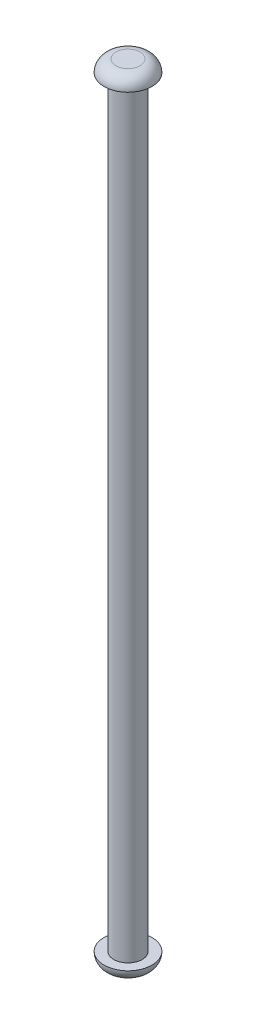
ISO-10303-21;
HEADER;
FILE_DESCRIPTION(('STEP AP214'),'2;1');
FILE_NAME('part.step','',(''),(''),'','','');
FILE_SCHEMA(('AUTOMOTIVE_DESIGN { 1 0 10303 214 1 1 1 1 }'));
ENDSEC;
DATA;
#1=APPLICATION_CONTEXT('core data for automotive mechanical design processes');
#2=APPLICATION_PROTOCOL_DEFINITION('international standard','automotive_design',2000,#1);
#3=PRODUCT_CONTEXT('',#1,'mechanical');
#4=PRODUCT('Part','Part','',(#3));
#5=PRODUCT_RELATED_PRODUCT_CATEGORY('part','',(#4));
#6=PRODUCT_DEFINITION_FORMATION('','',#4);
#7=PRODUCT_DEFINITION_CONTEXT('part definition',#1,'design');
#8=PRODUCT_DEFINITION('design','',#6,#7);
#9=PRODUCT_DEFINITION_SHAPE('','',#8);
#10=(LENGTH_UNIT() NAMED_UNIT(*) SI_UNIT(.MILLI.,.METRE.));
#11=(NAMED_UNIT(*) PLANE_ANGLE_UNIT() SI_UNIT($,.RADIAN.));
#12=(NAMED_UNIT(*) SI_UNIT($,.STERADIAN.) SOLID_ANGLE_UNIT());
#13=UNCERTAINTY_MEASURE_WITH_UNIT(LENGTH_MEASURE(1.E-05),#10,'distance_accuracy_value','');
#14=(GEOMETRIC_REPRESENTATION_CONTEXT(3) GLOBAL_UNCERTAINTY_ASSIGNED_CONTEXT((#13)) GLOBAL_UNIT_ASSIGNED_CONTEXT((#10,
#11,#12)) REPRESENTATION_CONTEXT('',''));
#15=CARTESIAN_POINT('',(0.,0.,0.));
#16=DIRECTION('',(0.,0.,1.));
#17=DIRECTION('',(1.,0.,0.));
#18=AXIS2_PLACEMENT_3D('',#15,#16,#17);
#19=CARTESIAN_POINT('',(2.206625,88.9,0.));
#20=DIRECTION('',(0.,-1.,0.));
#21=DIRECTION('',(0.,0.,-1.));
#22=AXIS2_PLACEMENT_3D('',#19,#20,#21);
#23=CYLINDRICAL_SURFACE('',#22,1.190625);
#24=CARTESIAN_POINT('',(2.206625,0.,0.));
#25=DIRECTION('',(0.,1.,0.));
#26=DIRECTION('',(0.,0.,1.));
#27=AXIS2_PLACEMENT_3D('',#24,#25,#26);
#28=CIRCLE('',#27,1.190625);
#29=CARTESIAN_POINT('',(2.206625,0.,1.190625));
#30=VERTEX_POINT('',#29);
#31=EDGE_CURVE('E63',#30,#30,#28,.T.);
#32=ORIENTED_EDGE('',*,*,#31,.T.);
#33=EDGE_LOOP('',(#32));
#34=FACE_BOUND('',#33,.T.);
#35=CARTESIAN_POINT('',(2.206625,63.5,0.));
#36=DIRECTION('',(0.,1.,0.));
#37=DIRECTION('',(0.,0.,1.));
#38=AXIS2_PLACEMENT_3D('',#35,#36,#37);
#39=CIRCLE('',#38,1.190625);
#40=CARTESIAN_POINT('',(2.206625,63.5,1.190625));
#41=VERTEX_POINT('',#40);
#42=EDGE_CURVE('E55',#41,#41,#39,.T.);
#43=ORIENTED_EDGE('',*,*,#42,.F.);
#44=EDGE_LOOP('',(#43));
#45=FACE_BOUND('',#44,.T.);
#46=ADVANCED_FACE('F42',(#34,#45),#23,.T.);
#47=CARTESIAN_POINT('',(2.206625,64.5,0.));
#48=DIRECTION('',(0.,1.,0.));
#49=DIRECTION('',(0.,0.,1.));
#50=AXIS2_PLACEMENT_3D('',#47,#48,#49);
#51=PLANE('',#50);
#52=CARTESIAN_POINT('',(2.206625,64.5,0.));
#53=DIRECTION('',(0.,1.,0.));
#54=DIRECTION('',(0.,0.,1.));
#55=AXIS2_PLACEMENT_3D('',#52,#53,#54);
#56=CIRCLE('',#55,1.);
#57=CARTESIAN_POINT('',(2.206625,64.5,1.));
#58=VERTEX_POINT('',#57);
#59=EDGE_CURVE('E50',#58,#58,#56,.T.);
#60=ORIENTED_EDGE('',*,*,#59,.T.);
#61=EDGE_LOOP('',(#60));
#62=FACE_BOUND('',#61,.T.);
#63=ADVANCED_FACE('F92',(#62),#51,.T.);
#64=CARTESIAN_POINT('',(2.206625,63.5,0.));
#65=DIRECTION('',(0.,1.,0.));
#66=DIRECTION('',(0.,0.,1.));
#67=AXIS2_PLACEMENT_3D('',#64,#65,#66);
#68=PLANE('',#67);
#69=ORIENTED_EDGE('',*,*,#42,.T.);
#70=EDGE_LOOP('',(#69));
#71=FACE_BOUND('',#70,.T.);
#72=CARTESIAN_POINT('',(2.206625,63.5,0.));
#73=DIRECTION('',(0.,1.,0.));
#74=DIRECTION('',(0.,0.,1.));
#75=AXIS2_PLACEMENT_3D('',#72,#73,#74);
#76=CIRCLE('',#75,2.);
#77=CARTESIAN_POINT('',(2.206625,63.5,2.));
#78=VERTEX_POINT('',#77);
#79=EDGE_CURVE('E60',#78,#78,#76,.T.);
#80=ORIENTED_EDGE('',*,*,#79,.F.);
#81=EDGE_LOOP('',(#80));
#82=FACE_BOUND('',#81,.T.);
#83=ADVANCED_FACE('F99',(#71,#82),#68,.F.);
#84=CARTESIAN_POINT('',(2.206625,63.5,0.));
#85=DIRECTION('',(0.,1.,0.));
#86=DIRECTION('',(0.,0.,1.));
#87=AXIS2_PLACEMENT_3D('',#84,#85,#86);
#88=TOROIDAL_SURFACE('',#87,1.,1.);
#89=ORIENTED_EDGE('',*,*,#79,.T.);
#90=EDGE_LOOP('',(#89));
#91=FACE_BOUND('',#90,.T.);
#92=ORIENTED_EDGE('',*,*,#59,.F.);
#93=EDGE_LOOP('',(#92));
#94=FACE_BOUND('',#93,.T.);
#95=ADVANCED_FACE('F87',(#91,#94),#88,.T.);
#96=CARTESIAN_POINT('',(2.206625,-1.,0.));
#97=DIRECTION('',(0.,-1.,0.));
#98=DIRECTION('',(0.,0.,-1.));
#99=AXIS2_PLACEMENT_3D('',#96,#97,#98);
#100=PLANE('',#99);
#101=CARTESIAN_POINT('',(2.206625,-1.,0.));
#102=DIRECTION('',(0.,-1.,0.));
#103=DIRECTION('',(0.,0.,-1.));
#104=AXIS2_PLACEMENT_3D('',#101,#102,#103);
#105=CIRCLE('',#104,1.);
#106=CARTESIAN_POINT('',(2.206625,-1.,-1.));
#107=VERTEX_POINT('',#106);
#108=EDGE_CURVE('E10',#107,#107,#105,.T.);
#109=ORIENTED_EDGE('',*,*,#108,.T.);
#110=EDGE_LOOP('',(#109));
#111=FACE_BOUND('',#110,.T.);
#112=ADVANCED_FACE('F79',(#111),#100,.T.);
#113=CARTESIAN_POINT('',(2.206625,0.,0.));
#114=DIRECTION('',(0.,-1.,0.));
#115=DIRECTION('',(0.,0.,-1.));
#116=AXIS2_PLACEMENT_3D('',#113,#114,#115);
#117=PLANE('',#116);
#118=ORIENTED_EDGE('',*,*,#31,.F.);
#119=EDGE_LOOP('',(#118));
#120=FACE_BOUND('',#119,.T.);
#121=CARTESIAN_POINT('',(2.206625,0.,0.));
#122=DIRECTION('',(0.,-1.,0.));
#123=DIRECTION('',(0.,0.,-1.));
#124=AXIS2_PLACEMENT_3D('',#121,#122,#123);
#125=CIRCLE('',#124,2.);
#126=CARTESIAN_POINT('',(2.206625,0.,-2.));
#127=VERTEX_POINT('',#126);
#128=EDGE_CURVE('E66',#127,#127,#125,.T.);
#129=ORIENTED_EDGE('',*,*,#128,.F.);
#130=EDGE_LOOP('',(#129));
#131=FACE_BOUND('',#130,.T.);
#132=ADVANCED_FACE('F77',(#120,#131),#117,.F.);
#133=CARTESIAN_POINT('',(2.206625,0.,0.));
#134=DIRECTION('',(0.,-1.,0.));
#135=DIRECTION('',(0.,0.,-1.));
#136=AXIS2_PLACEMENT_3D('',#133,#134,#135);
#137=TOROIDAL_SURFACE('',#136,1.,1.);
#138=ORIENTED_EDGE('',*,*,#128,.T.);
#139=EDGE_LOOP('',(#138));
#140=FACE_BOUND('',#139,.T.);
#141=ORIENTED_EDGE('',*,*,#108,.F.);
#142=EDGE_LOOP('',(#141));
#143=FACE_BOUND('',#142,.T.);
#144=ADVANCED_FACE('F44',(#140,#143),#137,.T.);
#145=CLOSED_SHELL('',(#46,#63,#83,#95,#112,#132,#144));
#146=MANIFOLD_SOLID_BREP('B2',#145);
#147=ADVANCED_BREP_SHAPE_REPRESENTATION('',(#18,#146),#14);
#148=SHAPE_DEFINITION_REPRESENTATION(#9,#147);
ENDSEC;
END-ISO-10303-21;
